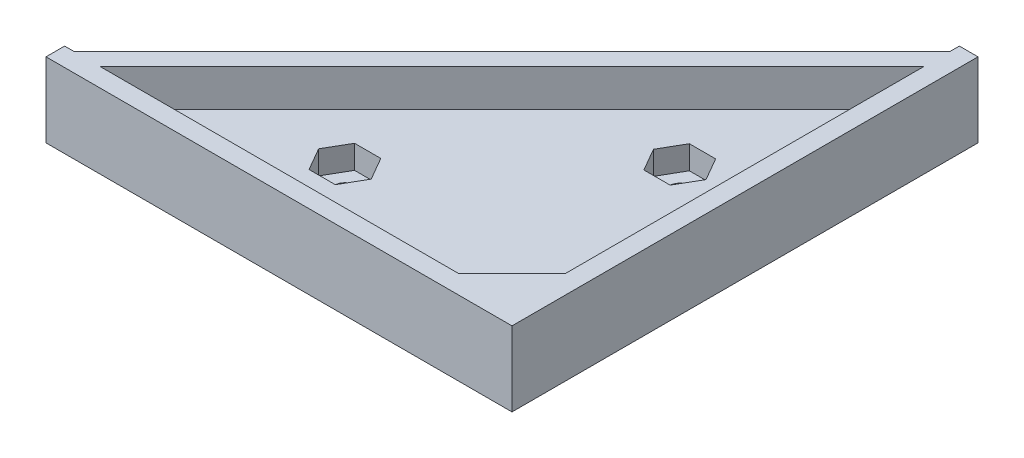
ISO-10303-21;
HEADER;
FILE_DESCRIPTION(('STEP AP214'),'2;1');
FILE_NAME('part.step','',(''),(''),'','','');
FILE_SCHEMA(('AUTOMOTIVE_DESIGN { 1 0 10303 214 1 1 1 1 }'));
ENDSEC;
DATA;
#1=APPLICATION_CONTEXT('core data for automotive mechanical design processes');
#2=APPLICATION_PROTOCOL_DEFINITION('international standard','automotive_design',2000,#1);
#3=PRODUCT_CONTEXT('',#1,'mechanical');
#4=PRODUCT('Part','Part','',(#3));
#5=PRODUCT_RELATED_PRODUCT_CATEGORY('part','',(#4));
#6=PRODUCT_DEFINITION_FORMATION('','',#4);
#7=PRODUCT_DEFINITION_CONTEXT('part definition',#1,'design');
#8=PRODUCT_DEFINITION('design','',#6,#7);
#9=PRODUCT_DEFINITION_SHAPE('','',#8);
#10=(LENGTH_UNIT() NAMED_UNIT(*) SI_UNIT(.MILLI.,.METRE.));
#11=(NAMED_UNIT(*) PLANE_ANGLE_UNIT() SI_UNIT($,.RADIAN.));
#12=(NAMED_UNIT(*) SI_UNIT($,.STERADIAN.) SOLID_ANGLE_UNIT());
#13=UNCERTAINTY_MEASURE_WITH_UNIT(LENGTH_MEASURE(1.E-05),#10,'distance_accuracy_value','');
#14=(GEOMETRIC_REPRESENTATION_CONTEXT(3) GLOBAL_UNCERTAINTY_ASSIGNED_CONTEXT((#13)) GLOBAL_UNIT_ASSIGNED_CONTEXT((#10,
#11,#12)) REPRESENTATION_CONTEXT('',''));
#15=CARTESIAN_POINT('',(0.,0.,0.));
#16=DIRECTION('',(0.,0.,1.));
#17=DIRECTION('',(1.,0.,0.));
#18=AXIS2_PLACEMENT_3D('',#15,#16,#17);
#19=CARTESIAN_POINT('',(-15.875,0.,-44.45));
#20=DIRECTION('',(0.,1.,0.));
#21=DIRECTION('',(0.,0.,1.));
#22=AXIS2_PLACEMENT_3D('',#19,#20,#21);
#23=CYLINDRICAL_SURFACE('',#22,1.75);
#24=CARTESIAN_POINT('',(-15.875,0.,-44.45));
#25=DIRECTION('',(0.,1.,0.));
#26=DIRECTION('',(0.,0.,1.));
#27=AXIS2_PLACEMENT_3D('',#24,#25,#26);
#28=CIRCLE('',#27,1.75);
#29=CARTESIAN_POINT('',(-15.875,0.,-42.7));
#30=VERTEX_POINT('',#29);
#31=EDGE_CURVE('E245',#30,#30,#28,.T.);
#32=ORIENTED_EDGE('',*,*,#31,.F.);
#33=EDGE_LOOP('',(#32));
#34=FACE_BOUND('',#33,.T.);
#35=CARTESIAN_POINT('',(-15.875,2.35,-44.45));
#36=DIRECTION('',(0.,1.,0.));
#37=DIRECTION('',(0.,0.,1.));
#38=AXIS2_PLACEMENT_3D('',#35,#36,#37);
#39=CIRCLE('',#38,1.75);
#40=CARTESIAN_POINT('',(-15.875,2.35,-42.7));
#41=VERTEX_POINT('',#40);
#42=EDGE_CURVE('E223',#41,#41,#39,.T.);
#43=ORIENTED_EDGE('',*,*,#42,.T.);
#44=EDGE_LOOP('',(#43));
#45=FACE_BOUND('',#44,.T.);
#46=ADVANCED_FACE('F41',(#34,#45),#23,.F.);
#47=CARTESIAN_POINT('',(-44.4607871589619,0.,-16.002));
#48=DIRECTION('',(0.,1.,0.));
#49=DIRECTION('',(0.,0.,1.));
#50=AXIS2_PLACEMENT_3D('',#47,#48,#49);
#51=CYLINDRICAL_SURFACE('',#50,1.75);
#52=CARTESIAN_POINT('',(-44.4607871589619,0.,-16.002));
#53=DIRECTION('',(0.,1.,0.));
#54=DIRECTION('',(0.,0.,1.));
#55=AXIS2_PLACEMENT_3D('',#52,#53,#54);
#56=CIRCLE('',#55,1.75);
#57=CARTESIAN_POINT('',(-44.4607871589619,0.,-14.252));
#58=VERTEX_POINT('',#57);
#59=EDGE_CURVE('E302',#58,#58,#56,.T.);
#60=ORIENTED_EDGE('',*,*,#59,.F.);
#61=EDGE_LOOP('',(#60));
#62=FACE_BOUND('',#61,.T.);
#63=CARTESIAN_POINT('',(-44.4607871589619,2.35,-16.002));
#64=DIRECTION('',(0.,1.,0.));
#65=DIRECTION('',(0.,0.,1.));
#66=AXIS2_PLACEMENT_3D('',#63,#64,#65);
#67=CIRCLE('',#66,1.75);
#68=CARTESIAN_POINT('',(-44.4607871589619,2.35,-14.252));
#69=VERTEX_POINT('',#68);
#70=EDGE_CURVE('E283',#69,#69,#67,.T.);
#71=ORIENTED_EDGE('',*,*,#70,.T.);
#72=EDGE_LOOP('',(#71));
#73=FACE_BOUND('',#72,.T.);
#74=ADVANCED_FACE('F420',(#62,#73),#51,.F.);
#75=CARTESIAN_POINT('',(-79.375,12.7,-3.175));
#76=DIRECTION('',(1.,0.,0.));
#77=DIRECTION('',(0.,0.,-1.));
#78=AXIS2_PLACEMENT_3D('',#75,#76,#77);
#79=PLANE('',#78);
#80=DIRECTION('',(0.,0.,1.));
#81=VECTOR('',#80,1.);
#82=CARTESIAN_POINT('',(-79.375,0.,-3.175));
#83=LINE('',#82,#81);
#84=CARTESIAN_POINT('',(-79.375,0.,-3.175));
#85=VERTEX_POINT('',#84);
#86=CARTESIAN_POINT('',(-79.375,0.,0.));
#87=VERTEX_POINT('',#86);
#88=EDGE_CURVE('E328',#85,#87,#83,.T.);
#89=ORIENTED_EDGE('',*,*,#88,.T.);
#90=DIRECTION('',(0.,-1.,0.));
#91=VECTOR('',#90,1.);
#92=CARTESIAN_POINT('',(-79.375,12.7,0.));
#93=LINE('',#92,#91);
#94=CARTESIAN_POINT('',(-79.375,12.7,0.));
#95=VERTEX_POINT('',#94);
#96=EDGE_CURVE('E378',#95,#87,#93,.T.);
#97=ORIENTED_EDGE('',*,*,#96,.F.);
#98=DIRECTION('',(0.,0.,1.));
#99=VECTOR('',#98,1.);
#100=CARTESIAN_POINT('',(-79.375,12.7,-3.175));
#101=LINE('',#100,#99);
#102=CARTESIAN_POINT('',(-79.375,12.7,-3.175));
#103=VERTEX_POINT('',#102);
#104=EDGE_CURVE('E331',#103,#95,#101,.T.);
#105=ORIENTED_EDGE('',*,*,#104,.F.);
#106=DIRECTION('',(0.,-1.,0.));
#107=VECTOR('',#106,1.);
#108=CARTESIAN_POINT('',(-79.375,12.7,-3.175));
#109=LINE('',#108,#107);
#110=EDGE_CURVE('E347',#103,#85,#109,.T.);
#111=ORIENTED_EDGE('',*,*,#110,.T.);
#112=EDGE_LOOP('',(#89,#97,#105,#111));
#113=FACE_BOUND('',#112,.T.);
#114=ADVANCED_FACE('F426',(#113),#79,.F.);
#115=CARTESIAN_POINT('',(-79.375,12.7,0.));
#116=DIRECTION('',(0.,0.,-1.));
#117=DIRECTION('',(-1.,0.,0.));
#118=AXIS2_PLACEMENT_3D('',#115,#116,#117);
#119=PLANE('',#118);
#120=DIRECTION('',(1.,0.,0.));
#121=VECTOR('',#120,1.);
#122=CARTESIAN_POINT('',(-79.375,0.,0.));
#123=LINE('',#122,#121);
#124=CARTESIAN_POINT('',(0.,0.,0.));
#125=VERTEX_POINT('',#124);
#126=EDGE_CURVE('E350',#87,#125,#123,.T.);
#127=ORIENTED_EDGE('',*,*,#126,.T.);
#128=DIRECTION('',(0.,-1.,0.));
#129=VECTOR('',#128,1.);
#130=CARTESIAN_POINT('',(0.,12.7,0.));
#131=LINE('',#130,#129);
#132=CARTESIAN_POINT('',(0.,12.7,0.));
#133=VERTEX_POINT('',#132);
#134=EDGE_CURVE('E375',#133,#125,#131,.T.);
#135=ORIENTED_EDGE('',*,*,#134,.F.);
#136=DIRECTION('',(1.,0.,0.));
#137=VECTOR('',#136,1.);
#138=CARTESIAN_POINT('',(-79.375,12.7,0.));
#139=LINE('',#138,#137);
#140=EDGE_CURVE('E334',#95,#133,#139,.T.);
#141=ORIENTED_EDGE('',*,*,#140,.F.);
#142=ORIENTED_EDGE('',*,*,#96,.T.);
#143=EDGE_LOOP('',(#127,#135,#141,#142));
#144=FACE_BOUND('',#143,.T.);
#145=ADVANCED_FACE('F689',(#144),#119,.F.);
#146=CARTESIAN_POINT('',(0.,12.7,0.));
#147=DIRECTION('',(-1.,0.,0.));
#148=DIRECTION('',(0.,0.,1.));
#149=AXIS2_PLACEMENT_3D('',#146,#147,#148);
#150=PLANE('',#149);
#151=DIRECTION('',(0.,0.,-1.));
#152=VECTOR('',#151,1.);
#153=CARTESIAN_POINT('',(0.,0.,0.));
#154=LINE('',#153,#152);
#155=CARTESIAN_POINT('',(0.,0.,-79.375));
#156=VERTEX_POINT('',#155);
#157=EDGE_CURVE('E352',#125,#156,#154,.T.);
#158=ORIENTED_EDGE('',*,*,#157,.T.);
#159=DIRECTION('',(0.,-1.,0.));
#160=VECTOR('',#159,1.);
#161=CARTESIAN_POINT('',(0.,12.7,-79.375));
#162=LINE('',#161,#160);
#163=CARTESIAN_POINT('',(0.,12.7,-79.375));
#164=VERTEX_POINT('',#163);
#165=EDGE_CURVE('E372',#164,#156,#162,.T.);
#166=ORIENTED_EDGE('',*,*,#165,.F.);
#167=DIRECTION('',(0.,0.,-1.));
#168=VECTOR('',#167,1.);
#169=CARTESIAN_POINT('',(0.,12.7,0.));
#170=LINE('',#169,#168);
#171=EDGE_CURVE('E337',#133,#164,#170,.T.);
#172=ORIENTED_EDGE('',*,*,#171,.F.);
#173=ORIENTED_EDGE('',*,*,#134,.T.);
#174=EDGE_LOOP('',(#158,#166,#172,#173));
#175=FACE_BOUND('',#174,.T.);
#176=ADVANCED_FACE('F679',(#175),#150,.F.);
#177=CARTESIAN_POINT('',(0.,12.7,-79.375));
#178=DIRECTION('',(0.,0.,1.));
#179=DIRECTION('',(1.,0.,0.));
#180=AXIS2_PLACEMENT_3D('',#177,#178,#179);
#181=PLANE('',#180);
#182=DIRECTION('',(-1.,0.,0.));
#183=VECTOR('',#182,1.);
#184=CARTESIAN_POINT('',(0.,0.,-79.375));
#185=LINE('',#184,#183);
#186=CARTESIAN_POINT('',(-3.175,0.,-79.375));
#187=VERTEX_POINT('',#186);
#188=EDGE_CURVE('E354',#156,#187,#185,.T.);
#189=ORIENTED_EDGE('',*,*,#188,.T.);
#190=DIRECTION('',(0.,-1.,0.));
#191=VECTOR('',#190,1.);
#192=CARTESIAN_POINT('',(-3.175,12.7,-79.375));
#193=LINE('',#192,#191);
#194=CARTESIAN_POINT('',(-3.175,12.7,-79.375));
#195=VERTEX_POINT('',#194);
#196=EDGE_CURVE('E369',#195,#187,#193,.T.);
#197=ORIENTED_EDGE('',*,*,#196,.F.);
#198=DIRECTION('',(-1.,0.,0.));
#199=VECTOR('',#198,1.);
#200=CARTESIAN_POINT('',(0.,12.7,-79.375));
#201=LINE('',#200,#199);
#202=EDGE_CURVE('E339',#164,#195,#201,.T.);
#203=ORIENTED_EDGE('',*,*,#202,.F.);
#204=ORIENTED_EDGE('',*,*,#165,.T.);
#205=EDGE_LOOP('',(#189,#197,#203,#204));
#206=FACE_BOUND('',#205,.T.);
#207=ADVANCED_FACE('F669',(#206),#181,.F.);
#208=CARTESIAN_POINT('',(-3.175,12.7,-79.375));
#209=DIRECTION('',(1.,0.,0.));
#210=DIRECTION('',(0.,0.,-1.));
#211=AXIS2_PLACEMENT_3D('',#208,#209,#210);
#212=PLANE('',#211);
#213=DIRECTION('',(0.,0.,1.));
#214=VECTOR('',#213,1.);
#215=CARTESIAN_POINT('',(-3.175,0.,-79.375));
#216=LINE('',#215,#214);
#217=CARTESIAN_POINT('',(-3.175,0.,-77.7875));
#218=VERTEX_POINT('',#217);
#219=EDGE_CURVE('E356',#187,#218,#216,.T.);
#220=ORIENTED_EDGE('',*,*,#219,.T.);
#221=DIRECTION('',(0.,-1.,0.));
#222=VECTOR('',#221,1.);
#223=CARTESIAN_POINT('',(-3.175,12.7,-77.7875));
#224=LINE('',#223,#222);
#225=CARTESIAN_POINT('',(-3.175,12.7,-77.7875));
#226=VERTEX_POINT('',#225);
#227=EDGE_CURVE('E366',#226,#218,#224,.T.);
#228=ORIENTED_EDGE('',*,*,#227,.F.);
#229=DIRECTION('',(0.,0.,1.));
#230=VECTOR('',#229,1.);
#231=CARTESIAN_POINT('',(-3.175,12.7,-79.375));
#232=LINE('',#231,#230);
#233=EDGE_CURVE('E341',#195,#226,#232,.T.);
#234=ORIENTED_EDGE('',*,*,#233,.F.);
#235=ORIENTED_EDGE('',*,*,#196,.T.);
#236=EDGE_LOOP('',(#220,#228,#234,#235));
#237=FACE_BOUND('',#236,.T.);
#238=ADVANCED_FACE('F659',(#237),#212,.F.);
#239=CARTESIAN_POINT('',(-3.175,12.7,-77.7875));
#240=DIRECTION('',(0.707106781186548,0.,0.707106781186548));
#241=DIRECTION('',(0.707106781186548,0.,-0.707106781186548));
#242=AXIS2_PLACEMENT_3D('',#239,#240,#241);
#243=PLANE('',#242);
#244=DIRECTION('',(-0.707106781186548,0.,0.707106781186548));
#245=VECTOR('',#244,1.);
#246=CARTESIAN_POINT('',(-3.175,0.,-77.7875));
#247=LINE('',#246,#245);
#248=CARTESIAN_POINT('',(-77.7875,0.,-3.175));
#249=VERTEX_POINT('',#248);
#250=EDGE_CURVE('E358',#218,#249,#247,.T.);
#251=ORIENTED_EDGE('',*,*,#250,.T.);
#252=DIRECTION('',(0.,-1.,0.));
#253=VECTOR('',#252,1.);
#254=CARTESIAN_POINT('',(-77.7875,12.7,-3.175));
#255=LINE('',#254,#253);
#256=CARTESIAN_POINT('',(-77.7875,12.7,-3.175));
#257=VERTEX_POINT('',#256);
#258=EDGE_CURVE('E363',#257,#249,#255,.T.);
#259=ORIENTED_EDGE('',*,*,#258,.F.);
#260=DIRECTION('',(-0.707106781186548,0.,0.707106781186548));
#261=VECTOR('',#260,1.);
#262=CARTESIAN_POINT('',(-3.175,12.7,-77.7875));
#263=LINE('',#262,#261);
#264=EDGE_CURVE('E343',#226,#257,#263,.T.);
#265=ORIENTED_EDGE('',*,*,#264,.F.);
#266=ORIENTED_EDGE('',*,*,#227,.T.);
#267=EDGE_LOOP('',(#251,#259,#265,#266));
#268=FACE_BOUND('',#267,.T.);
#269=ADVANCED_FACE('F649',(#268),#243,.F.);
#270=CARTESIAN_POINT('',(-77.7875,12.7,-3.175));
#271=DIRECTION('',(0.,0.,1.));
#272=DIRECTION('',(1.,0.,0.));
#273=AXIS2_PLACEMENT_3D('',#270,#271,#272);
#274=PLANE('',#273);
#275=DIRECTION('',(-1.,0.,0.));
#276=VECTOR('',#275,1.);
#277=CARTESIAN_POINT('',(-77.7875,0.,-3.175));
#278=LINE('',#277,#276);
#279=EDGE_CURVE('E335',#249,#85,#278,.T.);
#280=ORIENTED_EDGE('',*,*,#279,.T.);
#281=ORIENTED_EDGE('',*,*,#110,.F.);
#282=DIRECTION('',(-1.,0.,0.));
#283=VECTOR('',#282,1.);
#284=CARTESIAN_POINT('',(-77.7875,12.7,-3.175));
#285=LINE('',#284,#283);
#286=EDGE_CURVE('E345',#257,#103,#285,.T.);
#287=ORIENTED_EDGE('',*,*,#286,.F.);
#288=ORIENTED_EDGE('',*,*,#258,.T.);
#289=EDGE_LOOP('',(#280,#281,#287,#288));
#290=FACE_BOUND('',#289,.T.);
#291=ADVANCED_FACE('F642',(#290),#274,.F.);
#292=CARTESIAN_POINT('',(0.,12.7,0.));
#293=DIRECTION('',(0.,1.,0.));
#294=DIRECTION('',(0.,0.,1.));
#295=AXIS2_PLACEMENT_3D('',#292,#293,#294);
#296=PLANE('',#295);
#297=DIRECTION('',(-0.707106781186548,0.,0.707106781186548));
#298=VECTOR('',#297,1.);
#299=CARTESIAN_POINT('',(-3.175,12.7,-73.2973719394654));
#300=LINE('',#299,#298);
#301=CARTESIAN_POINT('',(-3.175,12.7,-73.2973719394654));
#302=VERTEX_POINT('',#301);
#303=CARTESIAN_POINT('',(-73.2973719394654,12.7,-3.175));
#304=VERTEX_POINT('',#303);
#305=EDGE_CURVE('E305',#302,#304,#300,.T.);
#306=ORIENTED_EDGE('',*,*,#305,.F.);
#307=DIRECTION('',(0.,0.,-1.));
#308=VECTOR('',#307,1.);
#309=CARTESIAN_POINT('',(-3.175,12.7,-12.2410988359689));
#310=LINE('',#309,#308);
#311=CARTESIAN_POINT('',(-3.175,12.7,-12.2410988359689));
#312=VERTEX_POINT('',#311);
#313=EDGE_CURVE('E312',#312,#302,#310,.T.);
#314=ORIENTED_EDGE('',*,*,#313,.F.);
#315=DIRECTION('',(0.707106781186549,0.,-0.707106781186546));
#316=VECTOR('',#315,1.);
#317=CARTESIAN_POINT('',(-12.241098835969,12.7,-3.175));
#318=LINE('',#317,#316);
#319=CARTESIAN_POINT('',(-12.241098835969,12.7,-3.175));
#320=VERTEX_POINT('',#319);
#321=EDGE_CURVE('E321',#320,#312,#318,.T.);
#322=ORIENTED_EDGE('',*,*,#321,.F.);
#323=DIRECTION('',(1.,0.,0.));
#324=VECTOR('',#323,1.);
#325=CARTESIAN_POINT('',(-73.2973719394654,12.7,-3.175));
#326=LINE('',#325,#324);
#327=EDGE_CURVE('E319',#304,#320,#326,.T.);
#328=ORIENTED_EDGE('',*,*,#327,.F.);
#329=EDGE_LOOP('',(#306,#314,#322,#328));
#330=FACE_BOUND('',#329,.T.);
#331=ORIENTED_EDGE('',*,*,#104,.T.);
#332=ORIENTED_EDGE('',*,*,#140,.T.);
#333=ORIENTED_EDGE('',*,*,#171,.T.);
#334=ORIENTED_EDGE('',*,*,#202,.T.);
#335=ORIENTED_EDGE('',*,*,#233,.T.);
#336=ORIENTED_EDGE('',*,*,#264,.T.);
#337=ORIENTED_EDGE('',*,*,#286,.T.);
#338=EDGE_LOOP('',(#331,#332,#333,#334,#335,#336,#337));
#339=FACE_BOUND('',#338,.T.);
#340=ADVANCED_FACE('F393',(#330,#339),#296,.T.);
#341=CARTESIAN_POINT('',(0.,0.,0.));
#342=DIRECTION('',(0.,1.,0.));
#343=DIRECTION('',(0.,0.,1.));
#344=AXIS2_PLACEMENT_3D('',#341,#342,#343);
#345=PLANE('',#344);
#346=ORIENTED_EDGE('',*,*,#59,.T.);
#347=EDGE_LOOP('',(#346));
#348=FACE_BOUND('',#347,.T.);
#349=ORIENTED_EDGE('',*,*,#31,.T.);
#350=EDGE_LOOP('',(#349));
#351=FACE_BOUND('',#350,.T.);
#352=ORIENTED_EDGE('',*,*,#88,.F.);
#353=ORIENTED_EDGE('',*,*,#279,.F.);
#354=ORIENTED_EDGE('',*,*,#250,.F.);
#355=ORIENTED_EDGE('',*,*,#219,.F.);
#356=ORIENTED_EDGE('',*,*,#188,.F.);
#357=ORIENTED_EDGE('',*,*,#157,.F.);
#358=ORIENTED_EDGE('',*,*,#126,.F.);
#359=EDGE_LOOP('',(#352,#353,#354,#355,#356,#357,#358));
#360=FACE_BOUND('',#359,.T.);
#361=ADVANCED_FACE('F406',(#348,#351,#360),#345,.F.);
#362=CARTESIAN_POINT('',(-3.175,6.35,-73.2973719394654));
#363=DIRECTION('',(-0.707106781186548,0.,-0.707106781186548));
#364=DIRECTION('',(-0.707106781186548,0.,0.707106781186548));
#365=AXIS2_PLACEMENT_3D('',#362,#363,#364);
#366=PLANE('',#365);
#367=ORIENTED_EDGE('',*,*,#305,.T.);
#368=DIRECTION('',(0.,1.,0.));
#369=VECTOR('',#368,1.);
#370=CARTESIAN_POINT('',(-73.2973719394654,6.35,-3.175));
#371=LINE('',#370,#369);
#372=CARTESIAN_POINT('',(-73.2973719394654,6.35,-3.175));
#373=VERTEX_POINT('',#372);
#374=EDGE_CURVE('E317',#373,#304,#371,.T.);
#375=ORIENTED_EDGE('',*,*,#374,.F.);
#376=DIRECTION('',(-0.707106781186548,0.,0.707106781186548));
#377=VECTOR('',#376,1.);
#378=CARTESIAN_POINT('',(-3.175,6.35,-73.2973719394654));
#379=LINE('',#378,#377);
#380=CARTESIAN_POINT('',(-3.175,6.35,-73.2973719394654));
#381=VERTEX_POINT('',#380);
#382=EDGE_CURVE('E308',#381,#373,#379,.T.);
#383=ORIENTED_EDGE('',*,*,#382,.F.);
#384=DIRECTION('',(0.,1.,0.));
#385=VECTOR('',#384,1.);
#386=CARTESIAN_POINT('',(-3.175,6.35,-73.2973719394654));
#387=LINE('',#386,#385);
#388=EDGE_CURVE('E326',#381,#302,#387,.T.);
#389=ORIENTED_EDGE('',*,*,#388,.T.);
#390=EDGE_LOOP('',(#367,#375,#383,#389));
#391=FACE_BOUND('',#390,.T.);
#392=ADVANCED_FACE('F404',(#391),#366,.F.);
#393=CARTESIAN_POINT('',(-3.175,6.35,-12.2410988359689));
#394=DIRECTION('',(1.,0.,0.));
#395=DIRECTION('',(0.,0.,-1.));
#396=AXIS2_PLACEMENT_3D('',#393,#394,#395);
#397=PLANE('',#396);
#398=DIRECTION('',(0.,0.,-1.));
#399=VECTOR('',#398,1.);
#400=CARTESIAN_POINT('',(-3.175,6.35,-12.2410988359689));
#401=LINE('',#400,#399);
#402=CARTESIAN_POINT('',(-3.175,6.35,-21.2213549570381));
#403=VERTEX_POINT('',#402);
#404=EDGE_CURVE('E315',#403,#381,#401,.T.);
#405=ORIENTED_EDGE('',*,*,#404,.F.);
#406=DIRECTION('',(0.,0.577350269189623,0.816496580927728));
#407=VECTOR('',#406,1.);
#408=CARTESIAN_POINT('',(-3.175,10.6035666552737,-15.2059033046921));
#409=LINE('',#408,#407);
#410=EDGE_CURVE('E50',#403,#312,#409,.T.);
#411=ORIENTED_EDGE('',*,*,#410,.T.);
#412=ORIENTED_EDGE('',*,*,#313,.T.);
#413=ORIENTED_EDGE('',*,*,#388,.F.);
#414=EDGE_LOOP('',(#405,#411,#412,#413));
#415=FACE_BOUND('',#414,.T.);
#416=ADVANCED_FACE('F386',(#415),#397,.F.);
#417=CARTESIAN_POINT('',(-73.2973719394654,6.35,-3.175));
#418=DIRECTION('',(0.,0.,1.));
#419=DIRECTION('',(1.,0.,0.));
#420=AXIS2_PLACEMENT_3D('',#417,#418,#419);
#421=PLANE('',#420);
#422=ORIENTED_EDGE('',*,*,#327,.T.);
#423=DIRECTION('',(-0.816496580927729,-0.577350269189622,0.));
#424=VECTOR('',#423,1.);
#425=CARTESIAN_POINT('',(-15.2059033046921,10.6035666552737,-3.175));
#426=LINE('',#425,#424);
#427=CARTESIAN_POINT('',(-21.2213549570382,6.35,-3.175));
#428=VERTEX_POINT('',#427);
#429=EDGE_CURVE('E11',#320,#428,#426,.T.);
#430=ORIENTED_EDGE('',*,*,#429,.T.);
#431=DIRECTION('',(1.,0.,0.));
#432=VECTOR('',#431,1.);
#433=CARTESIAN_POINT('',(-73.2973719394654,6.35,-3.175));
#434=LINE('',#433,#432);
#435=EDGE_CURVE('E311',#373,#428,#434,.T.);
#436=ORIENTED_EDGE('',*,*,#435,.F.);
#437=ORIENTED_EDGE('',*,*,#374,.T.);
#438=EDGE_LOOP('',(#422,#430,#436,#437));
#439=FACE_BOUND('',#438,.T.);
#440=ADVANCED_FACE('F399',(#439),#421,.F.);
#441=CARTESIAN_POINT('',(0.,6.35,0.));
#442=DIRECTION('',(0.,1.,0.));
#443=DIRECTION('',(0.,0.,1.));
#444=AXIS2_PLACEMENT_3D('',#441,#442,#443);
#445=PLANE('',#444);
#446=DIRECTION('',(1.,0.,0.));
#447=VECTOR('',#446,1.);
#448=CARTESIAN_POINT('',(-18.1122322931098,6.35,-40.575));
#449=LINE('',#448,#447);
#450=CARTESIAN_POINT('',(-18.1122322931098,6.35,-40.575));
#451=VERTEX_POINT('',#450);
#452=CARTESIAN_POINT('',(-13.6377677068902,6.35,-40.575));
#453=VERTEX_POINT('',#452);
#454=EDGE_CURVE('E57',#451,#453,#449,.T.);
#455=ORIENTED_EDGE('',*,*,#454,.F.);
#456=DIRECTION('',(0.5,0.,0.866025403784439));
#457=VECTOR('',#456,1.);
#458=CARTESIAN_POINT('',(-20.3494645862196,6.35,-44.45));
#459=LINE('',#458,#457);
#460=CARTESIAN_POINT('',(-20.3494645862196,6.35,-44.45));
#461=VERTEX_POINT('',#460);
#462=EDGE_CURVE('E217',#461,#451,#459,.T.);
#463=ORIENTED_EDGE('',*,*,#462,.F.);
#464=DIRECTION('',(-0.5,0.,0.866025403784439));
#465=VECTOR('',#464,1.);
#466=CARTESIAN_POINT('',(-18.1122322931098,6.35,-48.325));
#467=LINE('',#466,#465);
#468=CARTESIAN_POINT('',(-18.1122322931098,6.35,-48.325));
#469=VERTEX_POINT('',#468);
#470=EDGE_CURVE('E220',#469,#461,#467,.T.);
#471=ORIENTED_EDGE('',*,*,#470,.F.);
#472=DIRECTION('',(-1.,0.,0.));
#473=VECTOR('',#472,1.);
#474=CARTESIAN_POINT('',(-13.6377677068902,6.35,-48.325));
#475=LINE('',#474,#473);
#476=CARTESIAN_POINT('',(-13.6377677068902,6.35,-48.325));
#477=VERTEX_POINT('',#476);
#478=EDGE_CURVE('E238',#477,#469,#475,.T.);
#479=ORIENTED_EDGE('',*,*,#478,.F.);
#480=DIRECTION('',(-0.5,0.,-0.866025403784439));
#481=VECTOR('',#480,1.);
#482=CARTESIAN_POINT('',(-11.4005354137804,6.35,-44.45));
#483=LINE('',#482,#481);
#484=CARTESIAN_POINT('',(-11.4005354137804,6.35,-44.45));
#485=VERTEX_POINT('',#484);
#486=EDGE_CURVE('E235',#485,#477,#483,.T.);
#487=ORIENTED_EDGE('',*,*,#486,.F.);
#488=DIRECTION('',(0.5,0.,-0.866025403784439));
#489=VECTOR('',#488,1.);
#490=CARTESIAN_POINT('',(-13.6377677068902,6.35,-40.575));
#491=LINE('',#490,#489);
#492=EDGE_CURVE('E233',#453,#485,#491,.T.);
#493=ORIENTED_EDGE('',*,*,#492,.F.);
#494=EDGE_LOOP('',(#455,#463,#471,#479,#487,#493));
#495=FACE_BOUND('',#494,.T.);
#496=DIRECTION('',(0.5,0.,-0.866025403784439));
#497=VECTOR('',#496,1.);
#498=CARTESIAN_POINT('',(-42.2235548658521,6.35,-12.127));
#499=LINE('',#498,#497);
#500=CARTESIAN_POINT('',(-42.2235548658521,6.35,-12.127));
#501=VERTEX_POINT('',#500);
#502=CARTESIAN_POINT('',(-39.9863225727423,6.35,-16.002));
#503=VERTEX_POINT('',#502);
#504=EDGE_CURVE('E65',#501,#503,#499,.T.);
#505=ORIENTED_EDGE('',*,*,#504,.F.);
#506=DIRECTION('',(1.,0.,0.));
#507=VECTOR('',#506,1.);
#508=CARTESIAN_POINT('',(-46.6980194520717,6.35,-12.127));
#509=LINE('',#508,#507);
#510=CARTESIAN_POINT('',(-46.6980194520717,6.35,-12.127));
#511=VERTEX_POINT('',#510);
#512=EDGE_CURVE('E266',#511,#501,#509,.T.);
#513=ORIENTED_EDGE('',*,*,#512,.F.);
#514=DIRECTION('',(0.5,0.,0.866025403784439));
#515=VECTOR('',#514,1.);
#516=CARTESIAN_POINT('',(-48.9352517451815,6.35,-16.002));
#517=LINE('',#516,#515);
#518=CARTESIAN_POINT('',(-48.9352517451815,6.35,-16.002));
#519=VERTEX_POINT('',#518);
#520=EDGE_CURVE('E269',#519,#511,#517,.T.);
#521=ORIENTED_EDGE('',*,*,#520,.F.);
#522=DIRECTION('',(-0.5,0.,0.866025403784439));
#523=VECTOR('',#522,1.);
#524=CARTESIAN_POINT('',(-46.6980194520717,6.35,-19.877));
#525=LINE('',#524,#523);
#526=CARTESIAN_POINT('',(-46.6980194520717,6.35,-19.877));
#527=VERTEX_POINT('',#526);
#528=EDGE_CURVE('E273',#527,#519,#525,.T.);
#529=ORIENTED_EDGE('',*,*,#528,.F.);
#530=DIRECTION('',(-1.,0.,0.));
#531=VECTOR('',#530,1.);
#532=CARTESIAN_POINT('',(-42.2235548658521,6.35,-19.877));
#533=LINE('',#532,#531);
#534=CARTESIAN_POINT('',(-42.2235548658521,6.35,-19.877));
#535=VERTEX_POINT('',#534);
#536=EDGE_CURVE('E276',#535,#527,#533,.T.);
#537=ORIENTED_EDGE('',*,*,#536,.F.);
#538=DIRECTION('',(-0.5,0.,-0.866025403784439));
#539=VECTOR('',#538,1.);
#540=CARTESIAN_POINT('',(-39.9863225727423,6.35,-16.002));
#541=LINE('',#540,#539);
#542=EDGE_CURVE('E279',#503,#535,#541,.T.);
#543=ORIENTED_EDGE('',*,*,#542,.F.);
#544=EDGE_LOOP('',(#505,#513,#521,#529,#537,#543));
#545=FACE_BOUND('',#544,.T.);
#546=ORIENTED_EDGE('',*,*,#435,.T.);
#547=DIRECTION('',(0.707106781186549,0.,-0.707106781186546));
#548=VECTOR('',#547,1.);
#549=CARTESIAN_POINT('',(-12.1981774785191,6.35,-12.1981774785191));
#550=LINE('',#549,#548);
#551=EDGE_CURVE('E381',#428,#403,#550,.T.);
#552=ORIENTED_EDGE('',*,*,#551,.T.);
#553=ORIENTED_EDGE('',*,*,#404,.T.);
#554=ORIENTED_EDGE('',*,*,#382,.T.);
#555=EDGE_LOOP('',(#546,#552,#553,#554));
#556=FACE_BOUND('',#555,.T.);
#557=ADVANCED_FACE('F401',(#495,#545,#556),#445,.T.);
#558=CARTESIAN_POINT('',(-12.1981774785191,6.35,-12.1981774785191));
#559=DIRECTION('',(0.499999999999997,-0.707106781186551,0.499999999999999));
#560=DIRECTION('',(0.707106781186549,0.,-0.707106781186546));
#561=AXIS2_PLACEMENT_3D('',#558,#559,#560);
#562=PLANE('',#561);
#563=ORIENTED_EDGE('',*,*,#429,.F.);
#564=ORIENTED_EDGE('',*,*,#321,.T.);
#565=ORIENTED_EDGE('',*,*,#410,.F.);
#566=ORIENTED_EDGE('',*,*,#551,.F.);
#567=EDGE_LOOP('',(#563,#564,#565,#566));
#568=FACE_BOUND('',#567,.T.);
#569=ADVANCED_FACE('F44',(#568),#562,.F.);
#570=CARTESIAN_POINT('',(-42.2235548658521,2.35,-12.127));
#571=DIRECTION('',(0.866025403784439,0.,0.5));
#572=DIRECTION('',(0.5,0.,-0.866025403784439));
#573=AXIS2_PLACEMENT_3D('',#570,#571,#572);
#574=PLANE('',#573);
#575=ORIENTED_EDGE('',*,*,#504,.T.);
#576=DIRECTION('',(0.,1.,0.));
#577=VECTOR('',#576,1.);
#578=CARTESIAN_POINT('',(-39.9863225727423,2.35,-16.002));
#579=LINE('',#578,#577);
#580=CARTESIAN_POINT('',(-39.9863225727423,2.35,-16.002));
#581=VERTEX_POINT('',#580);
#582=EDGE_CURVE('E253',#581,#503,#579,.T.);
#583=ORIENTED_EDGE('',*,*,#582,.F.);
#584=DIRECTION('',(0.5,0.,-0.866025403784439));
#585=VECTOR('',#584,1.);
#586=CARTESIAN_POINT('',(-42.2235548658521,2.35,-12.127));
#587=LINE('',#586,#585);
#588=CARTESIAN_POINT('',(-42.2235548658521,2.35,-12.127));
#589=VERTEX_POINT('',#588);
#590=EDGE_CURVE('E270',#589,#581,#587,.T.);
#591=ORIENTED_EDGE('',*,*,#590,.F.);
#592=DIRECTION('',(0.,1.,0.));
#593=VECTOR('',#592,1.);
#594=CARTESIAN_POINT('',(-42.2235548658521,2.35,-12.127));
#595=LINE('',#594,#593);
#596=EDGE_CURVE('E264',#589,#501,#595,.T.);
#597=ORIENTED_EDGE('',*,*,#596,.T.);
#598=EDGE_LOOP('',(#575,#583,#591,#597));
#599=FACE_BOUND('',#598,.T.);
#600=ADVANCED_FACE('F447',(#599),#574,.F.);
#601=CARTESIAN_POINT('',(-46.6980194520717,2.35,-12.127));
#602=DIRECTION('',(0.,0.,1.));
#603=DIRECTION('',(1.,0.,0.));
#604=AXIS2_PLACEMENT_3D('',#601,#602,#603);
#605=PLANE('',#604);
#606=ORIENTED_EDGE('',*,*,#512,.T.);
#607=ORIENTED_EDGE('',*,*,#596,.F.);
#608=DIRECTION('',(1.,0.,0.));
#609=VECTOR('',#608,1.);
#610=CARTESIAN_POINT('',(-46.6980194520717,2.35,-12.127));
#611=LINE('',#610,#609);
#612=CARTESIAN_POINT('',(-46.6980194520717,2.35,-12.127));
#613=VERTEX_POINT('',#612);
#614=EDGE_CURVE('E255',#613,#589,#611,.T.);
#615=ORIENTED_EDGE('',*,*,#614,.F.);
#616=DIRECTION('',(0.,1.,0.));
#617=VECTOR('',#616,1.);
#618=CARTESIAN_POINT('',(-46.6980194520717,2.35,-12.127));
#619=LINE('',#618,#617);
#620=EDGE_CURVE('E262',#613,#511,#619,.T.);
#621=ORIENTED_EDGE('',*,*,#620,.T.);
#622=EDGE_LOOP('',(#606,#607,#615,#621));
#623=FACE_BOUND('',#622,.T.);
#624=ADVANCED_FACE('F491',(#623),#605,.F.);
#625=CARTESIAN_POINT('',(-48.9352517451815,2.35,-16.002));
#626=DIRECTION('',(-0.866025403784439,0.,0.5));
#627=DIRECTION('',(0.5,0.,0.866025403784439));
#628=AXIS2_PLACEMENT_3D('',#625,#626,#627);
#629=PLANE('',#628);
#630=ORIENTED_EDGE('',*,*,#520,.T.);
#631=ORIENTED_EDGE('',*,*,#620,.F.);
#632=DIRECTION('',(0.5,0.,0.866025403784439));
#633=VECTOR('',#632,1.);
#634=CARTESIAN_POINT('',(-48.9352517451815,2.35,-16.002));
#635=LINE('',#634,#633);
#636=CARTESIAN_POINT('',(-48.9352517451815,2.35,-16.002));
#637=VERTEX_POINT('',#636);
#638=EDGE_CURVE('E286',#637,#613,#635,.T.);
#639=ORIENTED_EDGE('',*,*,#638,.F.);
#640=DIRECTION('',(0.,1.,0.));
#641=VECTOR('',#640,1.);
#642=CARTESIAN_POINT('',(-48.9352517451815,2.35,-16.002));
#643=LINE('',#642,#641);
#644=EDGE_CURVE('E260',#637,#519,#643,.T.);
#645=ORIENTED_EDGE('',*,*,#644,.T.);
#646=EDGE_LOOP('',(#630,#631,#639,#645));
#647=FACE_BOUND('',#646,.T.);
#648=ADVANCED_FACE('F499',(#647),#629,.F.);
#649=CARTESIAN_POINT('',(-46.6980194520717,2.35,-19.877));
#650=DIRECTION('',(-0.866025403784439,0.,-0.5));
#651=DIRECTION('',(-0.5,0.,0.866025403784439));
#652=AXIS2_PLACEMENT_3D('',#649,#650,#651);
#653=PLANE('',#652);
#654=ORIENTED_EDGE('',*,*,#528,.T.);
#655=ORIENTED_EDGE('',*,*,#644,.F.);
#656=DIRECTION('',(-0.5,0.,0.866025403784439));
#657=VECTOR('',#656,1.);
#658=CARTESIAN_POINT('',(-46.6980194520717,2.35,-19.877));
#659=LINE('',#658,#657);
#660=CARTESIAN_POINT('',(-46.6980194520717,2.35,-19.877));
#661=VERTEX_POINT('',#660);
#662=EDGE_CURVE('E289',#661,#637,#659,.T.);
#663=ORIENTED_EDGE('',*,*,#662,.F.);
#664=DIRECTION('',(0.,1.,0.));
#665=VECTOR('',#664,1.);
#666=CARTESIAN_POINT('',(-46.6980194520717,2.35,-19.877));
#667=LINE('',#666,#665);
#668=EDGE_CURVE('E258',#661,#527,#667,.T.);
#669=ORIENTED_EDGE('',*,*,#668,.T.);
#670=EDGE_LOOP('',(#654,#655,#663,#669));
#671=FACE_BOUND('',#670,.T.);
#672=ADVANCED_FACE('F508',(#671),#653,.F.);
#673=CARTESIAN_POINT('',(-42.2235548658521,2.35,-19.877));
#674=DIRECTION('',(0.,0.,-1.));
#675=DIRECTION('',(-1.,0.,0.));
#676=AXIS2_PLACEMENT_3D('',#673,#674,#675);
#677=PLANE('',#676);
#678=ORIENTED_EDGE('',*,*,#536,.T.);
#679=ORIENTED_EDGE('',*,*,#668,.F.);
#680=DIRECTION('',(-1.,0.,0.));
#681=VECTOR('',#680,1.);
#682=CARTESIAN_POINT('',(-42.2235548658521,2.35,-19.877));
#683=LINE('',#682,#681);
#684=CARTESIAN_POINT('',(-42.2235548658521,2.35,-19.877));
#685=VERTEX_POINT('',#684);
#686=EDGE_CURVE('E292',#685,#661,#683,.T.);
#687=ORIENTED_EDGE('',*,*,#686,.F.);
#688=DIRECTION('',(0.,1.,0.));
#689=VECTOR('',#688,1.);
#690=CARTESIAN_POINT('',(-42.2235548658521,2.35,-19.877));
#691=LINE('',#690,#689);
#692=EDGE_CURVE('E256',#685,#535,#691,.T.);
#693=ORIENTED_EDGE('',*,*,#692,.T.);
#694=EDGE_LOOP('',(#678,#679,#687,#693));
#695=FACE_BOUND('',#694,.T.);
#696=ADVANCED_FACE('F517',(#695),#677,.F.);
#697=CARTESIAN_POINT('',(-39.9863225727423,2.35,-16.002));
#698=DIRECTION('',(0.866025403784439,0.,-0.499999999999999));
#699=DIRECTION('',(-0.5,0.,-0.866025403784439));
#700=AXIS2_PLACEMENT_3D('',#697,#698,#699);
#701=PLANE('',#700);
#702=ORIENTED_EDGE('',*,*,#542,.T.);
#703=ORIENTED_EDGE('',*,*,#692,.F.);
#704=DIRECTION('',(-0.5,0.,-0.866025403784439));
#705=VECTOR('',#704,1.);
#706=CARTESIAN_POINT('',(-39.9863225727423,2.35,-16.002));
#707=LINE('',#706,#705);
#708=EDGE_CURVE('E295',#581,#685,#707,.T.);
#709=ORIENTED_EDGE('',*,*,#708,.F.);
#710=ORIENTED_EDGE('',*,*,#582,.T.);
#711=EDGE_LOOP('',(#702,#703,#709,#710));
#712=FACE_BOUND('',#711,.T.);
#713=ADVANCED_FACE('F526',(#712),#701,.F.);
#714=CARTESIAN_POINT('',(0.,2.35,0.));
#715=DIRECTION('',(0.,1.,0.));
#716=DIRECTION('',(0.,0.,1.));
#717=AXIS2_PLACEMENT_3D('',#714,#715,#716);
#718=PLANE('',#717);
#719=ORIENTED_EDGE('',*,*,#70,.F.);
#720=EDGE_LOOP('',(#719));
#721=FACE_BOUND('',#720,.T.);
#722=ORIENTED_EDGE('',*,*,#590,.T.);
#723=ORIENTED_EDGE('',*,*,#708,.T.);
#724=ORIENTED_EDGE('',*,*,#686,.T.);
#725=ORIENTED_EDGE('',*,*,#662,.T.);
#726=ORIENTED_EDGE('',*,*,#638,.T.);
#727=ORIENTED_EDGE('',*,*,#614,.T.);
#728=EDGE_LOOP('',(#722,#723,#724,#725,#726,#727));
#729=FACE_BOUND('',#728,.T.);
#730=ADVANCED_FACE('F535',(#721,#729),#718,.T.);
#731=CARTESIAN_POINT('',(-18.1122322931098,2.35,-40.575));
#732=DIRECTION('',(0.,0.,1.));
#733=DIRECTION('',(1.,0.,0.));
#734=AXIS2_PLACEMENT_3D('',#731,#732,#733);
#735=PLANE('',#734);
#736=ORIENTED_EDGE('',*,*,#454,.T.);
#737=DIRECTION('',(0.,1.,0.));
#738=VECTOR('',#737,1.);
#739=CARTESIAN_POINT('',(-13.6377677068902,2.35,-40.575));
#740=LINE('',#739,#738);
#741=CARTESIAN_POINT('',(-13.6377677068902,2.35,-40.575));
#742=VERTEX_POINT('',#741);
#743=EDGE_CURVE('E194',#742,#453,#740,.T.);
#744=ORIENTED_EDGE('',*,*,#743,.F.);
#745=DIRECTION('',(1.,0.,0.));
#746=VECTOR('',#745,1.);
#747=CARTESIAN_POINT('',(-18.1122322931098,2.35,-40.575));
#748=LINE('',#747,#746);
#749=CARTESIAN_POINT('',(-18.1122322931098,2.35,-40.575));
#750=VERTEX_POINT('',#749);
#751=EDGE_CURVE('E198',#750,#742,#748,.T.);
#752=ORIENTED_EDGE('',*,*,#751,.F.);
#753=DIRECTION('',(0.,1.,0.));
#754=VECTOR('',#753,1.);
#755=CARTESIAN_POINT('',(-18.1122322931098,2.35,-40.575));
#756=LINE('',#755,#754);
#757=EDGE_CURVE('E243',#750,#451,#756,.T.);
#758=ORIENTED_EDGE('',*,*,#757,.T.);
#759=EDGE_LOOP('',(#736,#744,#752,#758));
#760=FACE_BOUND('',#759,.T.);
#761=ADVANCED_FACE('F196',(#760),#735,.F.);
#762=CARTESIAN_POINT('',(-20.3494645862196,2.35,-44.45));
#763=DIRECTION('',(-0.866025403784439,0.,0.5));
#764=DIRECTION('',(0.5,0.,0.866025403784439));
#765=AXIS2_PLACEMENT_3D('',#762,#763,#764);
#766=PLANE('',#765);
#767=ORIENTED_EDGE('',*,*,#462,.T.);
#768=ORIENTED_EDGE('',*,*,#757,.F.);
#769=DIRECTION('',(0.5,0.,0.866025403784439));
#770=VECTOR('',#769,1.);
#771=CARTESIAN_POINT('',(-20.3494645862196,2.35,-44.45));
#772=LINE('',#771,#770);
#773=CARTESIAN_POINT('',(-20.3494645862196,2.35,-44.45));
#774=VERTEX_POINT('',#773);
#775=EDGE_CURVE('E204',#774,#750,#772,.T.);
#776=ORIENTED_EDGE('',*,*,#775,.F.);
#777=DIRECTION('',(0.,1.,0.));
#778=VECTOR('',#777,1.);
#779=CARTESIAN_POINT('',(-20.3494645862196,2.35,-44.45));
#780=LINE('',#779,#778);
#781=EDGE_CURVE('E246',#774,#461,#780,.T.);
#782=ORIENTED_EDGE('',*,*,#781,.T.);
#783=EDGE_LOOP('',(#767,#768,#776,#782));
#784=FACE_BOUND('',#783,.T.);
#785=ADVANCED_FACE('F551',(#784),#766,.F.);
#786=CARTESIAN_POINT('',(-18.1122322931098,2.35,-48.325));
#787=DIRECTION('',(-0.866025403784439,0.,-0.5));
#788=DIRECTION('',(-0.5,0.,0.866025403784439));
#789=AXIS2_PLACEMENT_3D('',#786,#787,#788);
#790=PLANE('',#789);
#791=ORIENTED_EDGE('',*,*,#470,.T.);
#792=ORIENTED_EDGE('',*,*,#781,.F.);
#793=DIRECTION('',(-0.5,0.,0.866025403784439));
#794=VECTOR('',#793,1.);
#795=CARTESIAN_POINT('',(-18.1122322931098,2.35,-48.325));
#796=LINE('',#795,#794);
#797=CARTESIAN_POINT('',(-18.1122322931098,2.35,-48.325));
#798=VERTEX_POINT('',#797);
#799=EDGE_CURVE('E229',#798,#774,#796,.T.);
#800=ORIENTED_EDGE('',*,*,#799,.F.);
#801=DIRECTION('',(0.,1.,0.));
#802=VECTOR('',#801,1.);
#803=CARTESIAN_POINT('',(-18.1122322931098,2.35,-48.325));
#804=LINE('',#803,#802);
#805=EDGE_CURVE('E248',#798,#469,#804,.T.);
#806=ORIENTED_EDGE('',*,*,#805,.T.);
#807=EDGE_LOOP('',(#791,#792,#800,#806));
#808=FACE_BOUND('',#807,.T.);
#809=ADVANCED_FACE('F559',(#808),#790,.F.);
#810=CARTESIAN_POINT('',(-13.6377677068902,2.35,-48.325));
#811=DIRECTION('',(0.,0.,-1.));
#812=DIRECTION('',(-1.,0.,0.));
#813=AXIS2_PLACEMENT_3D('',#810,#811,#812);
#814=PLANE('',#813);
#815=ORIENTED_EDGE('',*,*,#478,.T.);
#816=ORIENTED_EDGE('',*,*,#805,.F.);
#817=DIRECTION('',(-1.,0.,0.));
#818=VECTOR('',#817,1.);
#819=CARTESIAN_POINT('',(-13.6377677068902,2.35,-48.325));
#820=LINE('',#819,#818);
#821=CARTESIAN_POINT('',(-13.6377677068902,2.35,-48.325));
#822=VERTEX_POINT('',#821);
#823=EDGE_CURVE('E226',#822,#798,#820,.T.);
#824=ORIENTED_EDGE('',*,*,#823,.F.);
#825=DIRECTION('',(0.,1.,0.));
#826=VECTOR('',#825,1.);
#827=CARTESIAN_POINT('',(-13.6377677068902,2.35,-48.325));
#828=LINE('',#827,#826);
#829=EDGE_CURVE('E250',#822,#477,#828,.T.);
#830=ORIENTED_EDGE('',*,*,#829,.T.);
#831=EDGE_LOOP('',(#815,#816,#824,#830));
#832=FACE_BOUND('',#831,.T.);
#833=ADVANCED_FACE('F568',(#832),#814,.F.);
#834=CARTESIAN_POINT('',(-11.4005354137804,2.35,-44.45));
#835=DIRECTION('',(0.866025403784439,0.,-0.5));
#836=DIRECTION('',(-0.5,0.,-0.866025403784439));
#837=AXIS2_PLACEMENT_3D('',#834,#835,#836);
#838=PLANE('',#837);
#839=ORIENTED_EDGE('',*,*,#486,.T.);
#840=ORIENTED_EDGE('',*,*,#829,.F.);
#841=DIRECTION('',(-0.5,0.,-0.866025403784439));
#842=VECTOR('',#841,1.);
#843=CARTESIAN_POINT('',(-11.4005354137804,2.35,-44.45));
#844=LINE('',#843,#842);
#845=CARTESIAN_POINT('',(-11.4005354137804,2.35,-44.45));
#846=VERTEX_POINT('',#845);
#847=EDGE_CURVE('E212',#846,#822,#844,.T.);
#848=ORIENTED_EDGE('',*,*,#847,.F.);
#849=DIRECTION('',(0.,1.,0.));
#850=VECTOR('',#849,1.);
#851=CARTESIAN_POINT('',(-11.4005354137804,2.35,-44.45));
#852=LINE('',#851,#850);
#853=EDGE_CURVE('E203',#846,#485,#852,.T.);
#854=ORIENTED_EDGE('',*,*,#853,.T.);
#855=EDGE_LOOP('',(#839,#840,#848,#854));
#856=FACE_BOUND('',#855,.T.);
#857=ADVANCED_FACE('F577',(#856),#838,.F.);
#858=CARTESIAN_POINT('',(-13.6377677068902,2.35,-40.575));
#859=DIRECTION('',(0.866025403784439,0.,0.5));
#860=DIRECTION('',(0.5,0.,-0.866025403784439));
#861=AXIS2_PLACEMENT_3D('',#858,#859,#860);
#862=PLANE('',#861);
#863=ORIENTED_EDGE('',*,*,#492,.T.);
#864=ORIENTED_EDGE('',*,*,#853,.F.);
#865=DIRECTION('',(0.5,0.,-0.866025403784439));
#866=VECTOR('',#865,1.);
#867=CARTESIAN_POINT('',(-13.6377677068902,2.35,-40.575));
#868=LINE('',#867,#866);
#869=EDGE_CURVE('E207',#742,#846,#868,.T.);
#870=ORIENTED_EDGE('',*,*,#869,.F.);
#871=ORIENTED_EDGE('',*,*,#743,.T.);
#872=EDGE_LOOP('',(#863,#864,#870,#871));
#873=FACE_BOUND('',#872,.T.);
#874=ADVANCED_FACE('F208',(#873),#862,.F.);
#875=CARTESIAN_POINT('',(0.,2.35,0.));
#876=DIRECTION('',(0.,1.,0.));
#877=DIRECTION('',(0.,0.,1.));
#878=AXIS2_PLACEMENT_3D('',#875,#876,#877);
#879=PLANE('',#878);
#880=ORIENTED_EDGE('',*,*,#42,.F.);
#881=EDGE_LOOP('',(#880));
#882=FACE_BOUND('',#881,.T.);
#883=ORIENTED_EDGE('',*,*,#751,.T.);
#884=ORIENTED_EDGE('',*,*,#869,.T.);
#885=ORIENTED_EDGE('',*,*,#847,.T.);
#886=ORIENTED_EDGE('',*,*,#823,.T.);
#887=ORIENTED_EDGE('',*,*,#799,.T.);
#888=ORIENTED_EDGE('',*,*,#775,.T.);
#889=EDGE_LOOP('',(#883,#884,#885,#886,#887,#888));
#890=FACE_BOUND('',#889,.T.);
#891=ADVANCED_FACE('F214',(#882,#890),#879,.T.);
#892=CLOSED_SHELL('',(#46,#74,#114,#145,#176,#207,#238,#269,#291,#340,#361,#392,#416,#440,#557,
#569,#600,#624,#648,#672,#696,#713,#730,#761,#785,#809,#833,#857,#874,#891));
#893=MANIFOLD_SOLID_BREP('B2',#892);
#894=ADVANCED_BREP_SHAPE_REPRESENTATION('',(#18,#893),#14);
#895=SHAPE_DEFINITION_REPRESENTATION(#9,#894);
ENDSEC;
END-ISO-10303-21;
